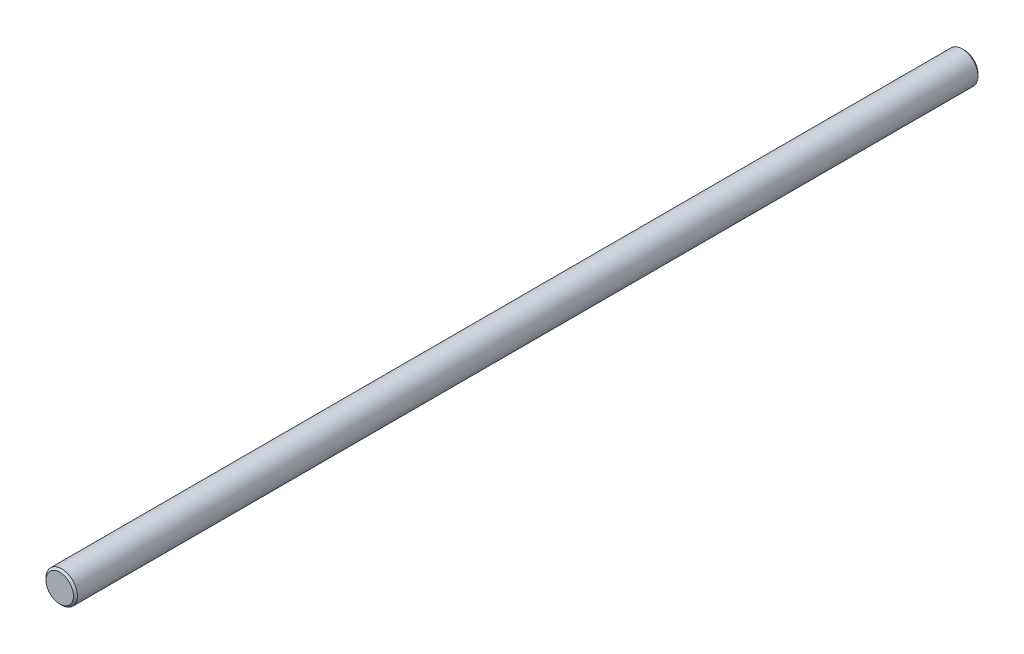
ISO-10303-21;
HEADER;
FILE_DESCRIPTION(('STEP AP214'),'2;1');
FILE_NAME('part.step','',(''),(''),'','','');
FILE_SCHEMA(('AUTOMOTIVE_DESIGN { 1 0 10303 214 1 1 1 1 }'));
ENDSEC;
DATA;
#1=APPLICATION_CONTEXT('core data for automotive mechanical design processes');
#2=APPLICATION_PROTOCOL_DEFINITION('international standard','automotive_design',2000,#1);
#3=PRODUCT_CONTEXT('',#1,'mechanical');
#4=PRODUCT('Part','Part','',(#3));
#5=PRODUCT_RELATED_PRODUCT_CATEGORY('part','',(#4));
#6=PRODUCT_DEFINITION_FORMATION('','',#4);
#7=PRODUCT_DEFINITION_CONTEXT('part definition',#1,'design');
#8=PRODUCT_DEFINITION('design','',#6,#7);
#9=PRODUCT_DEFINITION_SHAPE('','',#8);
#10=(LENGTH_UNIT() NAMED_UNIT(*) SI_UNIT(.MILLI.,.METRE.));
#11=(NAMED_UNIT(*) PLANE_ANGLE_UNIT() SI_UNIT($,.RADIAN.));
#12=(NAMED_UNIT(*) SI_UNIT($,.STERADIAN.) SOLID_ANGLE_UNIT());
#13=UNCERTAINTY_MEASURE_WITH_UNIT(LENGTH_MEASURE(1.E-05),#10,'distance_accuracy_value','');
#14=(GEOMETRIC_REPRESENTATION_CONTEXT(3) GLOBAL_UNCERTAINTY_ASSIGNED_CONTEXT((#13)) GLOBAL_UNIT_ASSIGNED_CONTEXT((#10,
#11,#12)) REPRESENTATION_CONTEXT('',''));
#15=CARTESIAN_POINT('',(0.,0.,0.));
#16=DIRECTION('',(0.,0.,1.));
#17=DIRECTION('',(1.,0.,0.));
#18=AXIS2_PLACEMENT_3D('',#15,#16,#17);
#19=CARTESIAN_POINT('',(0.,0.,115.));
#20=DIRECTION('',(0.,0.,-1.));
#21=DIRECTION('',(-1.,0.,0.));
#22=AXIS2_PLACEMENT_3D('',#19,#20,#21);
#23=CYLINDRICAL_SURFACE('',#22,4.);
#24=CARTESIAN_POINT('',(0.,0.,-114.5));
#25=DIRECTION('',(0.,0.,1.));
#26=DIRECTION('',(1.,0.,0.));
#27=AXIS2_PLACEMENT_3D('',#24,#25,#26);
#28=CIRCLE('',#27,4.);
#29=CARTESIAN_POINT('',(4.,0.,-114.5));
#30=VERTEX_POINT('',#29);
#31=EDGE_CURVE('E49',#30,#30,#28,.T.);
#32=ORIENTED_EDGE('',*,*,#31,.T.);
#33=EDGE_LOOP('',(#32));
#34=FACE_BOUND('',#33,.T.);
#35=CARTESIAN_POINT('',(0.,0.,114.5));
#36=DIRECTION('',(0.,0.,1.));
#37=DIRECTION('',(1.,0.,0.));
#38=AXIS2_PLACEMENT_3D('',#35,#36,#37);
#39=CIRCLE('',#38,4.);
#40=CARTESIAN_POINT('',(4.,0.,114.5));
#41=VERTEX_POINT('',#40);
#42=EDGE_CURVE('E53',#41,#41,#39,.F.);
#43=ORIENTED_EDGE('',*,*,#42,.T.);
#44=EDGE_LOOP('',(#43));
#45=FACE_BOUND('',#44,.T.);
#46=ADVANCED_FACE('F37',(#34,#45),#23,.T.);
#47=CARTESIAN_POINT('',(0.,0.,115.));
#48=DIRECTION('',(0.,0.,1.));
#49=DIRECTION('',(1.,0.,0.));
#50=AXIS2_PLACEMENT_3D('',#47,#48,#49);
#51=PLANE('',#50);
#52=CARTESIAN_POINT('',(0.,0.,115.));
#53=DIRECTION('',(0.,0.,1.));
#54=DIRECTION('',(1.,0.,0.));
#55=AXIS2_PLACEMENT_3D('',#52,#53,#54);
#56=CIRCLE('',#55,3.5);
#57=CARTESIAN_POINT('',(3.5,0.,115.));
#58=VERTEX_POINT('',#57);
#59=EDGE_CURVE('E10',#58,#58,#56,.T.);
#60=ORIENTED_EDGE('',*,*,#59,.T.);
#61=EDGE_LOOP('',(#60));
#62=FACE_BOUND('',#61,.T.);
#63=ADVANCED_FACE('F69',(#62),#51,.T.);
#64=CARTESIAN_POINT('',(0.,0.,-115.));
#65=DIRECTION('',(0.,0.,1.));
#66=DIRECTION('',(1.,0.,0.));
#67=AXIS2_PLACEMENT_3D('',#64,#65,#66);
#68=PLANE('',#67);
#69=CARTESIAN_POINT('',(0.,0.,-115.));
#70=DIRECTION('',(0.,0.,1.));
#71=DIRECTION('',(1.,0.,0.));
#72=AXIS2_PLACEMENT_3D('',#69,#70,#71);
#73=CIRCLE('',#72,3.50000000000003);
#74=CARTESIAN_POINT('',(3.50000000000003,0.,-115.));
#75=VERTEX_POINT('',#74);
#76=EDGE_CURVE('E45',#75,#75,#73,.F.);
#77=ORIENTED_EDGE('',*,*,#76,.T.);
#78=EDGE_LOOP('',(#77));
#79=FACE_BOUND('',#78,.T.);
#80=ADVANCED_FACE('F66',(#79),#68,.F.);
#81=CARTESIAN_POINT('',(0.,0.,-114.5));
#82=DIRECTION('',(0.,0.,1.));
#83=DIRECTION('',(1.,0.,0.));
#84=AXIS2_PLACEMENT_3D('',#81,#82,#83);
#85=CONICAL_SURFACE('',#84,4.,0.785398163397445);
#86=ORIENTED_EDGE('',*,*,#76,.F.);
#87=EDGE_LOOP('',(#86));
#88=FACE_BOUND('',#87,.T.);
#89=ORIENTED_EDGE('',*,*,#31,.F.);
#90=EDGE_LOOP('',(#89));
#91=FACE_BOUND('',#90,.T.);
#92=ADVANCED_FACE('F62',(#88,#91),#85,.T.);
#93=CARTESIAN_POINT('',(0.,0.,115.));
#94=DIRECTION('',(0.,0.,-1.));
#95=DIRECTION('',(-1.,0.,0.));
#96=AXIS2_PLACEMENT_3D('',#93,#94,#95);
#97=CONICAL_SURFACE('',#96,3.5,0.785398163397431);
#98=ORIENTED_EDGE('',*,*,#42,.F.);
#99=EDGE_LOOP('',(#98));
#100=FACE_BOUND('',#99,.T.);
#101=ORIENTED_EDGE('',*,*,#59,.F.);
#102=EDGE_LOOP('',(#101));
#103=FACE_BOUND('',#102,.T.);
#104=ADVANCED_FACE('F40',(#100,#103),#97,.T.);
#105=CLOSED_SHELL('',(#46,#63,#80,#92,#104));
#106=MANIFOLD_SOLID_BREP('B2',#105);
#107=ADVANCED_BREP_SHAPE_REPRESENTATION('',(#18,#106),#14);
#108=SHAPE_DEFINITION_REPRESENTATION(#9,#107);
ENDSEC;
END-ISO-10303-21;
